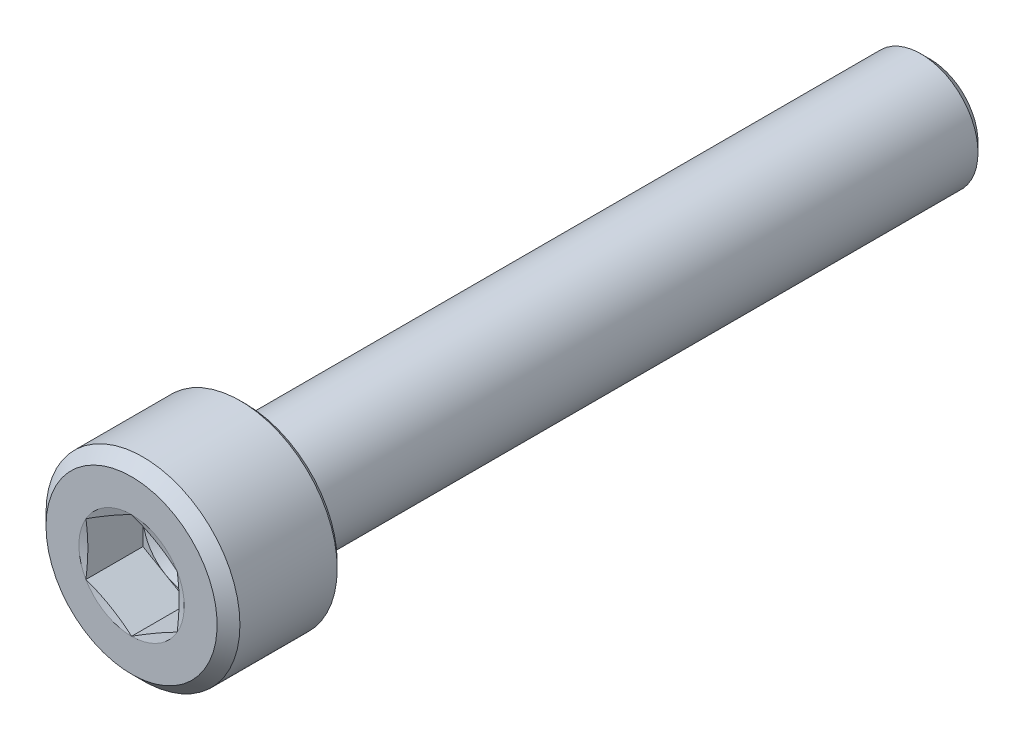
ISO-10303-21;
HEADER;
FILE_DESCRIPTION(('STEP AP214'),'2;1');
FILE_NAME('part.step','',(''),(''),'','','');
FILE_SCHEMA(('AUTOMOTIVE_DESIGN { 1 0 10303 214 1 1 1 1 }'));
ENDSEC;
DATA;
#1=APPLICATION_CONTEXT('core data for automotive mechanical design processes');
#2=APPLICATION_PROTOCOL_DEFINITION('international standard','automotive_design',2000,#1);
#3=PRODUCT_CONTEXT('',#1,'mechanical');
#4=PRODUCT('Part','Part','',(#3));
#5=PRODUCT_RELATED_PRODUCT_CATEGORY('part','',(#4));
#6=PRODUCT_DEFINITION_FORMATION('','',#4);
#7=PRODUCT_DEFINITION_CONTEXT('part definition',#1,'design');
#8=PRODUCT_DEFINITION('design','',#6,#7);
#9=PRODUCT_DEFINITION_SHAPE('','',#8);
#10=(LENGTH_UNIT() NAMED_UNIT(*) SI_UNIT(.MILLI.,.METRE.));
#11=(NAMED_UNIT(*) PLANE_ANGLE_UNIT() SI_UNIT($,.RADIAN.));
#12=(NAMED_UNIT(*) SI_UNIT($,.STERADIAN.) SOLID_ANGLE_UNIT());
#13=UNCERTAINTY_MEASURE_WITH_UNIT(LENGTH_MEASURE(1.E-05),#10,'distance_accuracy_value','');
#14=(GEOMETRIC_REPRESENTATION_CONTEXT(3) GLOBAL_UNCERTAINTY_ASSIGNED_CONTEXT((#13)) GLOBAL_UNIT_ASSIGNED_CONTEXT((#10,
#11,#12)) REPRESENTATION_CONTEXT('',''));
#15=CARTESIAN_POINT('',(0.,0.,0.));
#16=DIRECTION('',(0.,0.,1.));
#17=DIRECTION('',(1.,0.,0.));
#18=AXIS2_PLACEMENT_3D('',#15,#16,#17);
#19=CARTESIAN_POINT('',(2.,1.15470053837925,-2.5));
#20=DIRECTION('',(0.5,0.866025403784439,0.));
#21=DIRECTION('',(0.,0.,-1.));
#22=AXIS2_PLACEMENT_3D('',#19,#20,#21);
#23=PLANE('',#22);
#24=CARTESIAN_POINT('',(0.,2.3094010767585,0.));
#25=CARTESIAN_POINT('',(0.0425633823119709,2.28482382570566,-0.00658527078297476));
#26=CARTESIAN_POINT('',(0.0851609621981744,2.26022123386399,-0.0128624617924369));
#27=CARTESIAN_POINT('',(0.169590719267182,2.21146278990734,-0.0246149197548439));
#28=CARTESIAN_POINT('',(0.211421466351945,2.18730767178011,-0.0301035344043213));
#29=CARTESIAN_POINT('',(0.294534709698704,2.13933338683679,-0.040280933909989));
#30=CARTESIAN_POINT('',(0.335816093292774,2.11551457414403,-0.0449804129267517));
#31=CARTESIAN_POINT('',(0.418067328723173,2.06807245954831,-0.0535800869691));
#32=CARTESIAN_POINT('',(0.459036573992681,2.04444936338046,-0.0574872034397301));
#33=CARTESIAN_POINT('',(0.542105942407446,1.9964713268923,-0.0646202919637414));
#34=CARTESIAN_POINT('',(0.584206512798949,1.97211395870297,-0.0678248446642616));
#35=CARTESIAN_POINT('',(0.667845331882696,1.92372969130639,-0.0733062525415356));
#36=CARTESIAN_POINT('',(0.709382918692335,1.89970310083371,-0.0755958396504206));
#37=CARTESIAN_POINT('',(0.792314561065246,1.85180334473725,-0.0792518110133403));
#38=CARTESIAN_POINT('',(0.833708317497489,1.82793000580705,-0.0806226814230358));
#39=CARTESIAN_POINT('',(0.916742308626357,1.78006798987556,-0.0824510114905856));
#40=CARTESIAN_POINT('',(0.958382685265035,1.75607937336024,-0.0829035836538504));
#41=CARTESIAN_POINT('',(1.04160656499749,1.70802844834745,-0.0829039536078804));
#42=CARTESIAN_POINT('',(1.08319008000349,1.68396616048509,-0.0824519850713464));
#43=CARTESIAN_POINT('',(1.16614232267812,1.6359959725784,-0.0806244508305484));
#44=CARTESIAN_POINT('',(1.20751106141079,1.6120879122194,-0.0792536194503931));
#45=CARTESIAN_POINT('',(1.29046039872099,1.56421931101609,-0.075597576905792));
#46=CARTESIAN_POINT('',(1.33204099774182,1.54025912804585,-0.0733077208074989));
#47=CARTESIAN_POINT('',(1.4157769716645,1.49200969870299,-0.0678257908964699));
#48=CARTESIAN_POINT('',(1.45793172268238,1.46772084361545,-0.0646208369566601));
#49=CARTESIAN_POINT('',(1.54102078903926,1.4197637523774,-0.0574880406163537));
#50=CARTESIAN_POINT('',(1.58195747255381,1.39609636968376,-0.053581927053499));
#51=CARTESIAN_POINT('',(1.6641612654645,1.34858874355377,-0.0449835352058574));
#52=CARTESIAN_POINT('',(1.70542789927246,1.32474894442612,-0.0402842703166062));
#53=CARTESIAN_POINT('',(1.78853179531606,1.27675920888577,-0.0301068254493336));
#54=CARTESIAN_POINT('',(1.83036819240582,1.25261006903423,-0.0246178875385511));
#55=CARTESIAN_POINT('',(1.91481706725898,1.20386805540337,-0.0128642509205647));
#56=CARTESIAN_POINT('',(1.95742818508913,1.1792760521365,-0.00658614229819594));
#57=CARTESIAN_POINT('',(2.,1.15470053837925,0.));
#58=B_SPLINE_CURVE_WITH_KNOTS('',3,(#24,#25,#26,#27,#28,#29,#30,#31,#32,#33,#34,#35,#36,#37,#38,
#39,#40,#41,#42,#43,#44,#45,#46,#47,#48,#49,#50,#51,#52,#53,#54,#55,#56,#57),.UNSPECIFIED.,.F.,
.F.,(4,2,2,2,2,2,2,2,2,2,2,2,2,2,2,2,4),(0.,0.148766874535286,0.294606820686169,
0.438274846282944,0.580628017656161,0.726853447545081,0.87096665161791,1.01437091148585,
1.15853643630558,1.30266472322194,1.44605605797195,1.59018143609231,1.73644485761236,
1.87877967487471,2.02244082191178,2.16828655385211,2.31707290991441),.UNSPECIFIED.);
#59=CARTESIAN_POINT('',(0.,2.30940107675851,0.));
#60=VERTEX_POINT('',#59);
#61=CARTESIAN_POINT('',(2.,1.15470053837925,0.));
#62=VERTEX_POINT('',#61);
#63=EDGE_CURVE('E261',#60,#62,#58,.T.);
#64=ORIENTED_EDGE('',*,*,#63,.F.);
#65=DIRECTION('',(0.,0.,1.));
#66=VECTOR('',#65,1.);
#67=CARTESIAN_POINT('',(0.,2.30940107675851,-2.5));
#68=LINE('',#67,#66);
#69=CARTESIAN_POINT('',(0.,2.30940107675851,-2.5));
#70=VERTEX_POINT('',#69);
#71=EDGE_CURVE('E341',#70,#60,#68,.T.);
#72=ORIENTED_EDGE('',*,*,#71,.F.);
#73=DIRECTION('',(-0.866025403784439,0.5,0.));
#74=VECTOR('',#73,1.);
#75=CARTESIAN_POINT('',(2.,1.15470053837925,-2.5));
#76=LINE('',#75,#74);
#77=CARTESIAN_POINT('',(1.,1.73205080756888,-2.5));
#78=VERTEX_POINT('',#77);
#79=EDGE_CURVE('E248',#78,#70,#76,.T.);
#80=ORIENTED_EDGE('',*,*,#79,.F.);
#81=DIRECTION('',(-0.866025403784439,0.5,0.));
#82=VECTOR('',#81,1.);
#83=CARTESIAN_POINT('',(2.,1.15470053837925,-2.5));
#84=LINE('',#83,#82);
#85=CARTESIAN_POINT('',(2.,1.15470053837925,-2.5));
#86=VERTEX_POINT('',#85);
#87=EDGE_CURVE('E235',#86,#78,#84,.T.);
#88=ORIENTED_EDGE('',*,*,#87,.F.);
#89=DIRECTION('',(0.,0.,1.));
#90=VECTOR('',#89,1.);
#91=CARTESIAN_POINT('',(2.,1.15470053837925,-2.5));
#92=LINE('',#91,#90);
#93=EDGE_CURVE('E11',#86,#62,#92,.T.);
#94=ORIENTED_EDGE('',*,*,#93,.T.);
#95=EDGE_LOOP('',(#64,#72,#80,#88,#94));
#96=FACE_BOUND('',#95,.T.);
#97=ADVANCED_FACE('F17',(#96),#23,.F.);
#98=CARTESIAN_POINT('',(2.,-1.15470053837925,-2.5));
#99=DIRECTION('',(1.,0.,0.));
#100=DIRECTION('',(0.,1.,0.));
#101=AXIS2_PLACEMENT_3D('',#98,#99,#100);
#102=PLANE('',#101);
#103=CARTESIAN_POINT('',(2.,1.15470053837925,0.));
#104=CARTESIAN_POINT('',(1.9999971758146,1.10559938016855,-0.00657877825937162));
#105=CARTESIAN_POINT('',(1.99998944699676,1.05645602304888,-0.0128501009115137));
#106=CARTESIAN_POINT('',(1.99997806658765,0.959054194252896,-0.0245924298625357));
#107=CARTESIAN_POINT('',(1.99997433781248,0.910797323995098,-0.0300767483155109));
#108=CARTESIAN_POINT('',(1.99998359751542,0.81492579320712,-0.0402471560748688));
#109=CARTESIAN_POINT('',(1.9999963378607,0.767312271204178,-0.0449439165892805));
#110=CARTESIAN_POINT('',(2.00003546653749,0.672453111011467,-0.0535397458043652));
#111=CARTESIAN_POINT('',(2.00006172870545,0.625208100919636,-0.0574457313280469));
#112=CARTESIAN_POINT('',(2.00004611837403,0.529274763219141,-0.0645855968989982));
#113=CARTESIAN_POINT('',(2.00000222670508,0.480584711064261,-0.0677964274113592));
#114=CARTESIAN_POINT('',(1.99991841748751,0.383860331701837,-0.0732888727540297));
#115=CARTESIAN_POINT('',(1.99987845152948,0.335826737171599,-0.0755832901194108));
#116=CARTESIAN_POINT('',(1.99986366588704,0.239962717981797,-0.0792453120947795));
#117=CARTESIAN_POINT('',(1.9998885239626,0.192132467715618,-0.0806174586142727));
#118=CARTESIAN_POINT('',(1.99994941208485,0.0962015340396727,-0.08245246044446));
#119=CARTESIAN_POINT('',(1.99998550051117,0.0481007579972217,-0.0829104692770044));
#120=CARTESIAN_POINT('',(2.,0.,-0.0829037686547589));
#121=B_SPLINE_CURVE_WITH_KNOTS('',3,(#103,#104,#105,#106,#107,#108,#109,#110,#111,#112,#113,
#114,#115,#116,#117,#118,#119,#120),.UNSPECIFIED.,.F.,.F.,(4,2,2,2,2,2,2,2,4),(0.,
0.148620259481538,0.294318135051254,0.437846221402298,0.580058773528502,0.726438720844375,
0.870695461275644,1.01423647053232,1.15853648999317),.UNSPECIFIED.);
#122=CARTESIAN_POINT('',(2.,0.,-0.082903768654759));
#123=VERTEX_POINT('',#122);
#124=EDGE_CURVE('E443',#62,#123,#121,.T.);
#125=ORIENTED_EDGE('',*,*,#124,.F.);
#126=ORIENTED_EDGE('',*,*,#93,.F.);
#127=DIRECTION('',(0.,1.,0.));
#128=VECTOR('',#127,1.);
#129=CARTESIAN_POINT('',(2.,-1.15470053837925,-2.5));
#130=LINE('',#129,#128);
#131=CARTESIAN_POINT('',(2.,0.,-2.5));
#132=VERTEX_POINT('',#131);
#133=EDGE_CURVE('E224',#132,#86,#130,.T.);
#134=ORIENTED_EDGE('',*,*,#133,.F.);
#135=DIRECTION('',(0.,1.,0.));
#136=VECTOR('',#135,1.);
#137=CARTESIAN_POINT('',(2.,-1.15470053837925,-2.5));
#138=LINE('',#137,#136);
#139=CARTESIAN_POINT('',(2.,-1.15470053837925,-2.5));
#140=VERTEX_POINT('',#139);
#141=EDGE_CURVE('E220',#140,#132,#138,.T.);
#142=ORIENTED_EDGE('',*,*,#141,.F.);
#143=DIRECTION('',(0.,0.,1.));
#144=VECTOR('',#143,1.);
#145=CARTESIAN_POINT('',(2.,-1.15470053837925,-2.5));
#146=LINE('',#145,#144);
#147=CARTESIAN_POINT('',(2.,-1.15470053837925,0.));
#148=VERTEX_POINT('',#147);
#149=EDGE_CURVE('E31',#140,#148,#146,.T.);
#150=ORIENTED_EDGE('',*,*,#149,.T.);
#151=CARTESIAN_POINT('',(2.,0.,-0.0829037686547589));
#152=CARTESIAN_POINT('',(1.99998555981411,-0.0480626337482096,-0.0829104454697722));
#153=CARTESIAN_POINT('',(1.99995090495526,-0.0961252790550645,-0.0824527966371758));
#154=CARTESIAN_POINT('',(1.99989390848693,-0.191988216165346,-0.0806195306727037));
#155=CARTESIAN_POINT('',(1.9998715050684,-0.23978859752026,-0.0792486003594746));
#156=CARTESIAN_POINT('',(1.99989058893969,-0.335600482143639,-0.0755899847635507));
#157=CARTESIAN_POINT('',(1.99993240569122,-0.383611805647936,-0.0732976169410381));
#158=CARTESIAN_POINT('',(2.00001693407639,-0.480298664501986,-0.0678104164072034));
#159=CARTESIAN_POINT('',(2.00005964977091,-0.528973461379009,-0.0646026718115913));
#160=CARTESIAN_POINT('',(2.00007157520278,-0.624916052866736,-0.0574667105464565));
#161=CARTESIAN_POINT('',(2.00004278566152,-0.67218552115141,-0.0535608791712345));
#162=CARTESIAN_POINT('',(2.00000007634783,-0.767094417138231,-0.0449640408208166));
#163=CARTESIAN_POINT('',(1.99998629681263,-0.814733214974058,-0.040266094585913));
#164=CARTESIAN_POINT('',(1.99997547969609,-0.910656840517129,-0.0300922148547882));
#165=CARTESIAN_POINT('',(1.99997869881092,-0.958940526378031,-0.0246055771048901));
#166=CARTESIAN_POINT('',(1.99998947348254,-1.05639814339213,-0.0128574794542081));
#167=CARTESIAN_POINT('',(1.99999711487367,-1.10557046827418,-0.00658266592061943));
#168=CARTESIAN_POINT('',(2.,-1.15470053837925,0.));
#169=B_SPLINE_CURVE_WITH_KNOTS('',3,(#151,#152,#153,#154,#155,#156,#157,#158,#159,#160,#161,
#162,#163,#164,#165,#166,#167,#168),.UNSPECIFIED.,.F.,.F.,(4,2,2,2,2,2,2,2,4),(0.,
0.144185638963415,0.287636981833131,0.431826719642445,0.578160405495087,0.720446033944631,
0.864049915829581,1.00982849989602,1.15853627726478),.UNSPECIFIED.);
#170=EDGE_CURVE('E469',#123,#148,#169,.T.);
#171=ORIENTED_EDGE('',*,*,#170,.F.);
#172=EDGE_LOOP('',(#125,#126,#134,#142,#150,#171));
#173=FACE_BOUND('',#172,.T.);
#174=ADVANCED_FACE('F222',(#173),#102,.F.);
#175=CARTESIAN_POINT('',(0.,-2.3094010767585,-2.5));
#176=DIRECTION('',(0.5,-0.866025403784439,0.));
#177=DIRECTION('',(0.,0.,-1.));
#178=AXIS2_PLACEMENT_3D('',#175,#176,#177);
#179=PLANE('',#178);
#180=CARTESIAN_POINT('',(2.,-1.15470053837925,0.));
#181=CARTESIAN_POINT('',(1.95743378507766,-1.17927288320565,-0.0065852707828837));
#182=CARTESIAN_POINT('',(1.91482852560134,-1.20386217360572,-0.0128624617922492));
#183=CARTESIAN_POINT('',(1.83038759595222,-1.2526012660842,-0.0246149197545318));
#184=CARTESIAN_POINT('',(1.78855327648046,-1.27675019665525,-0.030103534403975));
#185=CARTESIAN_POINT('',(1.7054497053178,-1.32474123431294,-0.0402809339096389));
#186=CARTESIAN_POINT('',(1.66418131664067,-1.34858255486255,-0.0449804129264252));
#187=CARTESIAN_POINT('',(1.58196962247549,-1.39609315694039,-0.0535800869689056));
#188=CARTESIAN_POINT('',(1.5410267984427,-1.4197620160339,-0.0574872034396377));
#189=CARTESIAN_POINT('',(1.45794191581271,-1.46771318111302,-0.0646202919637392));
#190=CARTESIAN_POINT('',(1.41579753099615,-1.49199466049072,-0.0678248446642694));
#191=CARTESIAN_POINT('',(1.33207611674604,-1.54023586886093,-0.0733062525415533));
#192=CARTESIAN_POINT('',(1.29049968562577,-1.56419517901357,-0.075595839650431));
#193=CARTESIAN_POINT('',(1.20755145882476,-1.61206621003797,-0.079251811013348));
#194=CARTESIAN_POINT('',(1.16617966262179,-1.63597758520144,-0.0806226814230399));
#195=CARTESIAN_POINT('',(1.08321294538366,-1.68395612293148,-0.0824510114905914));
#196=CARTESIAN_POINT('',(1.04161800575987,-1.70802343866645,-0.0829035836538532));
#197=CARTESIAN_POINT('',(0.958392744156322,-1.7560719702104,-0.0829039536078792));
#198=CARTESIAN_POINT('',(0.916762434090979,-1.78005320665323,-0.0824519850713494));
#199=CARTESIAN_POINT('',(0.833742911401647,-1.82790686215718,-0.080624450830552));
#200=CARTESIAN_POINT('',(0.792353554409066,-1.85177921064272,-0.0792536194503983));
#201=CARTESIAN_POINT('',(0.709423461068239,-1.89968114337871,-0.0755975769057984));
#202=CARTESIAN_POINT('',(0.667883034426375,-1.92371090695011,-0.0733077208075098));
#203=CARTESIAN_POINT('',(0.584229815936511,-1.97210367290616,-0.067825790896475));
#204=CARTESIAN_POINT('',(0.542117674893325,-1.99646633063398,-0.0646208369566592));
#205=CARTESIAN_POINT('',(0.459041082411246,-2.04444502725692,-0.0574880406162984));
#206=CARTESIAN_POINT('',(0.418076185999905,-2.06806354378067,-0.0535819270533825));
#207=CARTESIAN_POINT('',(0.335831478442079,-2.1155003036641,-0.0449835352056614));
#208=CARTESIAN_POINT('',(0.294552289872298,-2.13931835730668,-0.0402842703163962));
#209=CARTESIAN_POINT('',(0.211440011751603,-2.18729357466367,-0.0301068254491258));
#210=CARTESIAN_POINT('',(0.169608044615814,-2.21145038742034,-0.0246178875383639));
#211=CARTESIAN_POINT('',(0.0851717851537173,-2.26021425154841,-0.012864250920452));
#212=CARTESIAN_POINT('',(0.0425689266799132,-2.2848205604393,-0.00658614229814123));
#213=CARTESIAN_POINT('',(0.,-2.3094010767585,0.));
#214=B_SPLINE_CURVE_WITH_KNOTS('',3,(#180,#181,#182,#183,#184,#185,#186,#187,#188,#189,#190,
#191,#192,#193,#194,#195,#196,#197,#198,#199,#200,#201,#202,#203,#204,#205,#206,#207,#208,#209,
#210,#211,#212,#213),.UNSPECIFIED.,.F.,.F.,(4,2,2,2,2,2,2,2,2,2,2,2,2,2,2,2,4),(0.,
0.148766874533244,0.294606820683524,0.438274846281021,0.58062801765617,0.726853447543114,
0.870966651615286,1.01437091148389,1.15853643630559,1.30266472322314,1.44605605797354,
1.5901814360935,1.73644485761236,1.87877967487588,2.02244082191339,2.16828655385335,
2.31707290991442),.UNSPECIFIED.);
#215=CARTESIAN_POINT('',(0.,-2.30940107675851,0.));
#216=VERTEX_POINT('',#215);
#217=EDGE_CURVE('E213',#148,#216,#214,.T.);
#218=ORIENTED_EDGE('',*,*,#217,.F.);
#219=ORIENTED_EDGE('',*,*,#149,.F.);
#220=DIRECTION('',(0.866025403784439,0.5,0.));
#221=VECTOR('',#220,1.);
#222=CARTESIAN_POINT('',(0.,-2.3094010767585,-2.5));
#223=LINE('',#222,#221);
#224=CARTESIAN_POINT('',(1.,-1.73205080756887,-2.5));
#225=VERTEX_POINT('',#224);
#226=EDGE_CURVE('E210',#225,#140,#223,.T.);
#227=ORIENTED_EDGE('',*,*,#226,.F.);
#228=DIRECTION('',(0.866025403784439,0.5,0.));
#229=VECTOR('',#228,1.);
#230=CARTESIAN_POINT('',(0.,-2.3094010767585,-2.5));
#231=LINE('',#230,#229);
#232=CARTESIAN_POINT('',(0.,-2.3094010767585,-2.5));
#233=VERTEX_POINT('',#232);
#234=EDGE_CURVE('E255',#233,#225,#231,.T.);
#235=ORIENTED_EDGE('',*,*,#234,.F.);
#236=DIRECTION('',(0.,0.,1.));
#237=VECTOR('',#236,1.);
#238=CARTESIAN_POINT('',(0.,-2.3094010767585,-2.5));
#239=LINE('',#238,#237);
#240=EDGE_CURVE('E199',#233,#216,#239,.T.);
#241=ORIENTED_EDGE('',*,*,#240,.T.);
#242=EDGE_LOOP('',(#218,#219,#227,#235,#241));
#243=FACE_BOUND('',#242,.T.);
#244=ADVANCED_FACE('F208',(#243),#179,.F.);
#245=CARTESIAN_POINT('',(-2.,-1.15470053837925,-2.5));
#246=DIRECTION('',(-0.5,-0.866025403784439,0.));
#247=DIRECTION('',(-0.866025403784439,0.5,0.));
#248=AXIS2_PLACEMENT_3D('',#245,#246,#247);
#249=PLANE('',#248);
#250=CARTESIAN_POINT('',(0.,-2.3094010767585,0.));
#251=CARTESIAN_POINT('',(-0.0425633823124517,-2.28482382570538,-0.00658527078305046));
#252=CARTESIAN_POINT('',(-0.0851609621991149,-2.26022123386338,-0.0128624617925928));
#253=CARTESIAN_POINT('',(-0.169590719268688,-2.21146278990626,-0.024614919755103));
#254=CARTESIAN_POINT('',(-0.211421466353557,-2.18730767177888,-0.0301035344046088));
#255=CARTESIAN_POINT('',(-0.294534709700233,-2.13933338683548,-0.04028093391028));
#256=CARTESIAN_POINT('',(-0.335816093294115,-2.11551457414279,-0.0449804129270233));
#257=CARTESIAN_POINT('',(-0.418067328723942,-2.06807245954753,-0.0535800869692619));
#258=CARTESIAN_POINT('',(-0.459036573993066,-2.04444936338007,-0.0574872034398075));
#259=CARTESIAN_POINT('',(-0.542105942407995,-1.99647132689215,-0.0646202919637441));
#260=CARTESIAN_POINT('',(-0.584206512800049,-1.97211395870268,-0.0678248446642561));
#261=CARTESIAN_POINT('',(-0.667845331884484,-1.92372969130583,-0.0733062525415221));
#262=CARTESIAN_POINT('',(-0.709382918694263,-1.89970310083303,-0.0755958396504133));
#263=CARTESIAN_POINT('',(-0.792314561067119,-1.85180334473646,-0.0792518110133352));
#264=CARTESIAN_POINT('',(-0.833708317499165,-1.82793000580629,-0.0806226814230336));
#265=CARTESIAN_POINT('',(-0.916742308627337,-1.78006798987506,-0.0824510114905825));
#266=CARTESIAN_POINT('',(-0.958382685265516,-1.75607937335996,-0.0829035836538506));
#267=CARTESIAN_POINT('',(-1.04160656499709,-1.70802844834768,-0.0829039536078818));
#268=CARTESIAN_POINT('',(-1.08319008000271,-1.68396616048559,-0.0824519850713441));
#269=CARTESIAN_POINT('',(-1.16614232267685,-1.6359959725793,-0.0806244508305463));
#270=CARTESIAN_POINT('',(-1.20751106140942,-1.61208791222044,-0.0792536194503888));
#271=CARTESIAN_POINT('',(-1.29046039871966,-1.56421931101721,-0.0755975769057861));
#272=CARTESIAN_POINT('',(-1.33204099774065,-1.54025912804693,-0.0733077208074876));
#273=CARTESIAN_POINT('',(-1.41577697166382,-1.49200969870367,-0.0678257908964654));
#274=CARTESIAN_POINT('',(-1.45793172268204,-1.4677208436158,-0.0646208369566626));
#275=CARTESIAN_POINT('',(-1.5410207890388,-1.41976375237752,-0.0574880406164197));
#276=CARTESIAN_POINT('',(-1.58195747255291,-1.39609636968399,-0.0535819270536368));
#277=CARTESIAN_POINT('',(-1.66416126546302,-1.34858874355423,-0.0449835352060884));
#278=CARTESIAN_POINT('',(-1.70542789927084,-1.32474894442669,-0.0402842703168537));
#279=CARTESIAN_POINT('',(-1.78853179531446,-1.27675920888644,-0.0301068254495781));
#280=CARTESIAN_POINT('',(-1.83036819240438,-1.25261006903488,-0.0246178875387715));
#281=CARTESIAN_POINT('',(-1.91481706725812,-1.20386805540381,-0.0128642509206973));
#282=CARTESIAN_POINT('',(-1.95742818508871,-1.17927605213674,-0.00658614229826027));
#283=CARTESIAN_POINT('',(-2.,-1.15470053837926,0.));
#284=B_SPLINE_CURVE_WITH_KNOTS('',3,(#250,#251,#252,#253,#254,#255,#256,#257,#258,#259,#260,
#261,#262,#263,#264,#265,#266,#267,#268,#269,#270,#271,#272,#273,#274,#275,#276,#277,#278,#279,
#280,#281,#282,#283),.UNSPECIFIED.,.F.,.F.,(4,2,2,2,2,2,2,2,2,2,2,2,2,2,2,2,4),(0.,
0.148766874536984,0.294606820688371,0.438274846284549,0.580628017656168,0.726853447546727,
0.870966651620108,1.01437091148751,1.15853643630558,1.30266472322055,1.44605605797009,
1.59018143609091,1.73644485761235,1.87877967487335,2.02244082190991,2.16828655385066,
2.3170729099144),.UNSPECIFIED.);
#285=CARTESIAN_POINT('',(-2.,-1.15470053837925,0.));
#286=VERTEX_POINT('',#285);
#287=EDGE_CURVE('E407',#216,#286,#284,.T.);
#288=ORIENTED_EDGE('',*,*,#287,.F.);
#289=ORIENTED_EDGE('',*,*,#240,.F.);
#290=DIRECTION('',(0.866025403784439,-0.5,0.));
#291=VECTOR('',#290,1.);
#292=CARTESIAN_POINT('',(-2.,-1.15470053837925,-2.5));
#293=LINE('',#292,#291);
#294=CARTESIAN_POINT('',(-1.,-1.73205080756887,-2.5));
#295=VERTEX_POINT('',#294);
#296=EDGE_CURVE('E228',#295,#233,#293,.T.);
#297=ORIENTED_EDGE('',*,*,#296,.F.);
#298=DIRECTION('',(0.866025403784439,-0.5,0.));
#299=VECTOR('',#298,1.);
#300=CARTESIAN_POINT('',(-2.,-1.15470053837925,-2.5));
#301=LINE('',#300,#299);
#302=CARTESIAN_POINT('',(-2.,-1.15470053837925,-2.5));
#303=VERTEX_POINT('',#302);
#304=EDGE_CURVE('E98',#303,#295,#301,.T.);
#305=ORIENTED_EDGE('',*,*,#304,.F.);
#306=DIRECTION('',(0.,0.,1.));
#307=VECTOR('',#306,1.);
#308=CARTESIAN_POINT('',(-2.,-1.15470053837925,-2.5));
#309=LINE('',#308,#307);
#310=EDGE_CURVE('E193',#303,#286,#309,.T.);
#311=ORIENTED_EDGE('',*,*,#310,.T.);
#312=EDGE_LOOP('',(#288,#289,#297,#305,#311));
#313=FACE_BOUND('',#312,.T.);
#314=ADVANCED_FACE('F414',(#313),#249,.F.);
#315=CARTESIAN_POINT('',(-2.,1.15470053837925,-2.5));
#316=DIRECTION('',(-1.,0.,0.));
#317=DIRECTION('',(0.,0.,1.));
#318=AXIS2_PLACEMENT_3D('',#315,#316,#317);
#319=PLANE('',#318);
#320=CARTESIAN_POINT('',(-2.,-1.15470053837926,0.));
#321=CARTESIAN_POINT('',(-1.99999713341261,-1.10548960119524,-0.00659349994683994));
#322=CARTESIAN_POINT('',(-1.99999001439798,-1.05623625144953,-0.0128780060927307));
#323=CARTESIAN_POINT('',(-1.99998060910477,-0.958615251215465,-0.0246431934130829));
#324=CARTESIAN_POINT('',(-1.99997823064012,-0.910249208018163,-0.0301372396865746));
#325=CARTESIAN_POINT('',(-1.99999041666403,-0.814158446504453,-0.0403236142290196));
#326=CARTESIAN_POINT('',(-2.00000473011996,-0.76643486816009,-0.0450266347192323));
#327=CARTESIAN_POINT('',(-2.00004652000518,-0.671352739896966,-0.0536314900251229));
#328=CARTESIAN_POINT('',(-2.00007387560003,-0.623994815190128,-0.0575402190336094));
#329=CARTESIAN_POINT('',(-2.00005845896974,-0.527888120565473,-0.0646777765433628));
#330=CARTESIAN_POINT('',(-2.00001369287065,-0.479137692036126,-0.0678843923543035));
#331=CARTESIAN_POINT('',(-1.99992846343813,-0.38229572529829,-0.0733654519077141));
#332=CARTESIAN_POINT('',(-1.99988794697284,-0.334204921765323,-0.0756527809453042));
#333=CARTESIAN_POINT('',(-1.99986859003052,-0.238227588755144,-0.0792997958800163));
#334=CARTESIAN_POINT('',(-1.99988944362067,-0.190341233728829,-0.0806640416301184));
#335=CARTESIAN_POINT('',(-1.99995548502895,-0.0942971448419419,-0.0824747486435702));
#336=CARTESIAN_POINT('',(-2.00000080135689,-0.0461393190190874,-0.0829163025262149));
#337=CARTESIAN_POINT('',(-1.99999920117611,0.0500238603427236,-0.0828907294700894));
#338=CARTESIAN_POINT('',(-1.9999525757529,0.0980292146733851,-0.0824264703640131));
#339=CARTESIAN_POINT('',(-1.99988530566595,0.193778523562446,-0.0805761348477542));
#340=CARTESIAN_POINT('',(-1.99986453033935,0.241522568216185,-0.079194749030331));
#341=CARTESIAN_POINT('',(-1.99988319873575,0.337220665629865,-0.0755193070115986));
#342=CARTESIAN_POINT('',(-1.99992295205882,0.385174538655754,-0.073220603238064));
#343=CARTESIAN_POINT('',(-2.00000494629768,0.481743325463302,-0.0677226422132793));
#344=CARTESIAN_POINT('',(-2.00004721534993,0.530357502799515,-0.0645105427039974));
#345=CARTESIAN_POINT('',(-2.00005964394824,0.62612676012278,-0.0573722164336154));
#346=CARTESIAN_POINT('',(-2.00003184313588,0.673283579034134,-0.0534691942966007));
#347=CARTESIAN_POINT('',(-1.99999170713457,0.767970011400858,-0.0448814384269832));
#348=CARTESIAN_POINT('',(-1.99997951884658,0.815498992151107,-0.0401897428011197));
#349=CARTESIAN_POINT('',(-1.99997163040192,0.911203850654714,-0.030031812894688));
#350=CARTESIAN_POINT('',(-1.9999761835141,0.959378588033395,-0.0245548958453313));
#351=CARTESIAN_POINT('',(-1.99998890540873,1.0566174773319,-0.0128296293417804));
#352=CARTESIAN_POINT('',(-1.99999714507433,1.10568002885256,-0.00656797916916223));
#353=CARTESIAN_POINT('',(-2.,1.15470053837925,0.));
#354=B_SPLINE_CURVE_WITH_KNOTS('',3,(#320,#321,#322,#323,#324,#325,#326,#327,#328,#329,#330,
#331,#332,#333,#334,#335,#336,#337,#338,#339,#340,#341,#342,#343,#344,#345,#346,#347,#348,#349,
#350,#351,#352,#353),.UNSPECIFIED.,.F.,.F.,(4,2,2,2,2,2,2,2,2,2,2,2,2,2,2,2,4),(0.,
0.148952547682911,0.294979106594678,0.438837566790982,0.581388350232403,0.72794815627218,
0.872375335412716,1.01608375931162,1.16055457798047,1.30456873960764,1.44785196522356,
1.59187054107806,1.73802363231839,1.87997181997091,2.02324604190021,2.16869661516907,
2.3170727653732),.UNSPECIFIED.);
#355=CARTESIAN_POINT('',(-2.,1.15470053837925,0.));
#356=VERTEX_POINT('',#355);
#357=EDGE_CURVE('E329',#286,#356,#354,.T.);
#358=ORIENTED_EDGE('',*,*,#357,.F.);
#359=ORIENTED_EDGE('',*,*,#310,.F.);
#360=DIRECTION('',(0.,-1.,0.));
#361=VECTOR('',#360,1.);
#362=CARTESIAN_POINT('',(-2.,1.15470053837925,-2.5));
#363=LINE('',#362,#361);
#364=CARTESIAN_POINT('',(-2.,0.,-2.5));
#365=VERTEX_POINT('',#364);
#366=EDGE_CURVE('E262',#365,#303,#363,.T.);
#367=ORIENTED_EDGE('',*,*,#366,.F.);
#368=DIRECTION('',(0.,-1.,0.));
#369=VECTOR('',#368,1.);
#370=CARTESIAN_POINT('',(-2.,1.15470053837925,-2.5));
#371=LINE('',#370,#369);
#372=CARTESIAN_POINT('',(-2.,1.15470053837925,-2.5));
#373=VERTEX_POINT('',#372);
#374=EDGE_CURVE('E113',#373,#365,#371,.T.);
#375=ORIENTED_EDGE('',*,*,#374,.F.);
#376=DIRECTION('',(0.,0.,1.));
#377=VECTOR('',#376,1.);
#378=CARTESIAN_POINT('',(-2.,1.15470053837925,-2.5));
#379=LINE('',#378,#377);
#380=EDGE_CURVE('E46',#373,#356,#379,.T.);
#381=ORIENTED_EDGE('',*,*,#380,.T.);
#382=EDGE_LOOP('',(#358,#359,#367,#375,#381));
#383=FACE_BOUND('',#382,.T.);
#384=ADVANCED_FACE('F19',(#383),#319,.F.);
#385=CARTESIAN_POINT('',(0.,2.30940107675851,-2.5));
#386=DIRECTION('',(-0.5,0.866025403784439,0.));
#387=DIRECTION('',(0.,0.,1.));
#388=AXIS2_PLACEMENT_3D('',#385,#386,#387);
#389=PLANE('',#388);
#390=CARTESIAN_POINT('',(-2.,1.15470053837925,0.));
#391=CARTESIAN_POINT('',(-1.95743378507658,1.17927288320626,-0.00658527078305043));
#392=CARTESIAN_POINT('',(-1.91482852559914,1.20386217360685,-0.0128624617925928));
#393=CARTESIAN_POINT('',(-1.83038759594849,1.25260126608589,-0.0246149197551029));
#394=CARTESIAN_POINT('',(-1.78855327647633,1.27675019665698,-0.0301035344046087));
#395=CARTESIAN_POINT('',(-1.70544970531361,1.32474123431442,-0.0402809339102798));
#396=CARTESIAN_POINT('',(-1.66418131663682,1.34858255486375,-0.0449804129270231));
#397=CARTESIAN_POINT('',(-1.58196962247316,1.396093156941,-0.0535800869692616));
#398=CARTESIAN_POINT('',(-1.54102679844153,1.4197620160342,-0.0574872034398072));
#399=CARTESIAN_POINT('',(-1.45794191581183,1.4677131811139,-0.0646202919637438));
#400=CARTESIAN_POINT('',(-1.41579753099439,1.4919946604925,-0.0678248446642558));
#401=CARTESIAN_POINT('',(-1.332076116743,1.54023586886373,-0.0733062525415215));
#402=CARTESIAN_POINT('',(-1.29049968562234,1.5641951790165,-0.0755958396504125));
#403=CARTESIAN_POINT('',(-1.20755145882121,1.61206621004067,-0.0792518110133349));
#404=CARTESIAN_POINT('',(-1.1661796626185,1.6359775852038,-0.0806226814230341));
#405=CARTESIAN_POINT('',(-1.08321294538163,1.6839561229328,-0.0824510114905808));
#406=CARTESIAN_POINT('',(-1.04161800575884,1.70802343866708,-0.082903583653846));
#407=CARTESIAN_POINT('',(-0.958392744156581,1.75607197021023,-0.0829039536078852));
#408=CARTESIAN_POINT('',(-0.916762434091534,1.78005320665294,-0.0824519850713484));
#409=CARTESIAN_POINT('',(-0.833742911402609,1.82790686215676,-0.0806244508305478));
#410=CARTESIAN_POINT('',(-0.792353554410137,1.85177921064227,-0.0792536194503939));
#411=CARTESIAN_POINT('',(-0.709423461069339,1.89968114337832,-0.0755975769057937));
#412=CARTESIAN_POINT('',(-0.667883034427395,1.9237109069498,-0.0733077208075013));
#413=CARTESIAN_POINT('',(-0.584229815937133,1.972103672906,-0.0678257908964709));
#414=CARTESIAN_POINT('',(-0.54211767489363,1.9964663306339,-0.06462083695666));
#415=CARTESIAN_POINT('',(-0.459041082411455,2.0444450272567,-0.0574880406163423));
#416=CARTESIAN_POINT('',(-0.418076186000337,2.06806354378022,-0.0535819270534749));
#417=CARTESIAN_POINT('',(-0.335831478442842,2.11550030366339,-0.0449835352058167));
#418=CARTESIAN_POINT('',(-0.294552289873171,2.13931835730593,-0.0402842703165626));
#419=CARTESIAN_POINT('',(-0.211440011752526,2.18729357466297,-0.0301068254492905));
#420=CARTESIAN_POINT('',(-0.169608044616676,2.21145038741972,-0.0246178875385123));
#421=CARTESIAN_POINT('',(-0.0851717851542553,2.26021425154807,-0.0128642509205413));
#422=CARTESIAN_POINT('',(-0.0425689266801875,2.28482056043914,-0.00658614229818459));
#423=CARTESIAN_POINT('',(0.,2.3094010767585,0.));
#424=B_SPLINE_CURVE_WITH_KNOTS('',3,(#390,#391,#392,#393,#394,#395,#396,#397,#398,#399,#400,
#401,#402,#403,#404,#405,#406,#407,#408,#409,#410,#411,#412,#413,#414,#415,#416,#417,#418,#419,
#420,#421,#422,#423),.UNSPECIFIED.,.F.,.F.,(4,2,2,2,2,2,2,2,2,2,2,2,2,2,2,2,4),(0.,
0.148766874536988,0.294606820688377,0.438274846284552,0.580628017656167,0.726853447546728,
0.870966651620106,1.01437091148751,1.15853643630558,1.30266472322219,1.44605605797229,
1.59018143609256,1.73644485761237,1.87877967487496,2.02244082191212,2.16828655385237,
2.31707290991441),.UNSPECIFIED.);
#425=EDGE_CURVE('E348',#356,#60,#424,.T.);
#426=ORIENTED_EDGE('',*,*,#425,.F.);
#427=ORIENTED_EDGE('',*,*,#380,.F.);
#428=DIRECTION('',(-0.866025403784439,-0.5,0.));
#429=VECTOR('',#428,1.);
#430=CARTESIAN_POINT('',(0.,2.30940107675851,-2.5));
#431=LINE('',#430,#429);
#432=CARTESIAN_POINT('',(-1.,1.73205080756888,-2.5));
#433=VERTEX_POINT('',#432);
#434=EDGE_CURVE('E276',#433,#373,#431,.T.);
#435=ORIENTED_EDGE('',*,*,#434,.F.);
#436=DIRECTION('',(-0.866025403784439,-0.5,0.));
#437=VECTOR('',#436,1.);
#438=CARTESIAN_POINT('',(0.,2.30940107675851,-2.5));
#439=LINE('',#438,#437);
#440=EDGE_CURVE('E251',#70,#433,#439,.T.);
#441=ORIENTED_EDGE('',*,*,#440,.F.);
#442=ORIENTED_EDGE('',*,*,#71,.T.);
#443=EDGE_LOOP('',(#426,#427,#435,#441,#442));
#444=FACE_BOUND('',#443,.T.);
#445=ADVANCED_FACE('F458',(#444),#389,.F.);
#446=CARTESIAN_POINT('',(0.,0.,-2.5));
#447=DIRECTION('',(0.,0.,1.));
#448=DIRECTION('',(1.,0.,0.));
#449=AXIS2_PLACEMENT_3D('',#446,#447,#448);
#450=PLANE('',#449);
#451=CARTESIAN_POINT('',(0.,0.,-2.5));
#452=DIRECTION('',(0.,0.,1.));
#453=DIRECTION('',(1.,0.,0.));
#454=AXIS2_PLACEMENT_3D('',#451,#452,#453);
#455=CIRCLE('',#454,2.);
#456=EDGE_CURVE('E534',#433,#365,#455,.T.);
#457=ORIENTED_EDGE('',*,*,#456,.F.);
#458=ORIENTED_EDGE('',*,*,#434,.T.);
#459=ORIENTED_EDGE('',*,*,#374,.T.);
#460=EDGE_LOOP('',(#457,#458,#459));
#461=FACE_BOUND('',#460,.T.);
#462=ADVANCED_FACE('F735',(#461),#450,.T.);
#463=CARTESIAN_POINT('',(0.,0.,-2.5));
#464=DIRECTION('',(0.,0.,1.));
#465=DIRECTION('',(1.,0.,0.));
#466=AXIS2_PLACEMENT_3D('',#463,#464,#465);
#467=PLANE('',#466);
#468=CARTESIAN_POINT('',(0.,0.,-2.5));
#469=DIRECTION('',(0.,0.,1.));
#470=DIRECTION('',(1.,0.,0.));
#471=AXIS2_PLACEMENT_3D('',#468,#469,#470);
#472=CIRCLE('',#471,2.);
#473=EDGE_CURVE('E486',#78,#433,#472,.T.);
#474=ORIENTED_EDGE('',*,*,#473,.F.);
#475=ORIENTED_EDGE('',*,*,#79,.T.);
#476=ORIENTED_EDGE('',*,*,#440,.T.);
#477=EDGE_LOOP('',(#474,#475,#476));
#478=FACE_BOUND('',#477,.T.);
#479=ADVANCED_FACE('F739',(#478),#467,.T.);
#480=CARTESIAN_POINT('',(0.,0.,-2.5));
#481=DIRECTION('',(0.,0.,1.));
#482=DIRECTION('',(1.,0.,0.));
#483=AXIS2_PLACEMENT_3D('',#480,#481,#482);
#484=PLANE('',#483);
#485=CARTESIAN_POINT('',(0.,0.,-2.5));
#486=DIRECTION('',(0.,0.,1.));
#487=DIRECTION('',(1.,0.,0.));
#488=AXIS2_PLACEMENT_3D('',#485,#486,#487);
#489=CIRCLE('',#488,2.);
#490=EDGE_CURVE('E270',#365,#295,#489,.T.);
#491=ORIENTED_EDGE('',*,*,#490,.F.);
#492=ORIENTED_EDGE('',*,*,#366,.T.);
#493=ORIENTED_EDGE('',*,*,#304,.T.);
#494=EDGE_LOOP('',(#491,#492,#493));
#495=FACE_BOUND('',#494,.T.);
#496=ADVANCED_FACE('F314',(#495),#484,.T.);
#497=CARTESIAN_POINT('',(0.,0.,-2.5));
#498=DIRECTION('',(0.,0.,1.));
#499=DIRECTION('',(1.,0.,0.));
#500=AXIS2_PLACEMENT_3D('',#497,#498,#499);
#501=PLANE('',#500);
#502=CARTESIAN_POINT('',(0.,0.,-2.5));
#503=DIRECTION('',(0.,0.,1.));
#504=DIRECTION('',(1.,0.,0.));
#505=AXIS2_PLACEMENT_3D('',#502,#503,#504);
#506=CIRCLE('',#505,2.);
#507=EDGE_CURVE('E268',#295,#225,#506,.T.);
#508=ORIENTED_EDGE('',*,*,#507,.F.);
#509=ORIENTED_EDGE('',*,*,#296,.T.);
#510=ORIENTED_EDGE('',*,*,#234,.T.);
#511=EDGE_LOOP('',(#508,#509,#510));
#512=FACE_BOUND('',#511,.T.);
#513=ADVANCED_FACE('F542',(#512),#501,.T.);
#514=CARTESIAN_POINT('',(0.,0.,-2.5));
#515=DIRECTION('',(0.,0.,1.));
#516=DIRECTION('',(1.,0.,0.));
#517=AXIS2_PLACEMENT_3D('',#514,#515,#516);
#518=PLANE('',#517);
#519=CARTESIAN_POINT('',(0.,0.,-2.5));
#520=DIRECTION('',(0.,0.,1.));
#521=DIRECTION('',(1.,0.,0.));
#522=AXIS2_PLACEMENT_3D('',#519,#520,#521);
#523=CIRCLE('',#522,2.);
#524=EDGE_CURVE('E232',#225,#132,#523,.T.);
#525=ORIENTED_EDGE('',*,*,#524,.F.);
#526=ORIENTED_EDGE('',*,*,#226,.T.);
#527=ORIENTED_EDGE('',*,*,#141,.T.);
#528=EDGE_LOOP('',(#525,#526,#527));
#529=FACE_BOUND('',#528,.T.);
#530=ADVANCED_FACE('F230',(#529),#518,.T.);
#531=CARTESIAN_POINT('',(0.,0.,-2.5));
#532=DIRECTION('',(0.,0.,1.));
#533=DIRECTION('',(1.,0.,0.));
#534=AXIS2_PLACEMENT_3D('',#531,#532,#533);
#535=PLANE('',#534);
#536=CARTESIAN_POINT('',(0.,0.,-2.5));
#537=DIRECTION('',(0.,0.,1.));
#538=DIRECTION('',(1.,0.,0.));
#539=AXIS2_PLACEMENT_3D('',#536,#537,#538);
#540=CIRCLE('',#539,2.);
#541=EDGE_CURVE('E491',#132,#78,#540,.T.);
#542=ORIENTED_EDGE('',*,*,#541,.F.);
#543=ORIENTED_EDGE('',*,*,#133,.T.);
#544=ORIENTED_EDGE('',*,*,#87,.T.);
#545=EDGE_LOOP('',(#542,#543,#544));
#546=FACE_BOUND('',#545,.T.);
#547=ADVANCED_FACE('F304',(#546),#535,.T.);
#548=CARTESIAN_POINT('',(0.,0.,-0.0829037686547588));
#549=DIRECTION('',(0.,0.,1.));
#550=DIRECTION('',(1.,0.,0.));
#551=AXIS2_PLACEMENT_3D('',#548,#549,#550);
#552=CONICAL_SURFACE('',#551,2.,1.30899693899575);
#553=ORIENTED_EDGE('',*,*,#63,.T.);
#554=CARTESIAN_POINT('',(0.,0.,0.));
#555=DIRECTION('',(0.,0.,1.));
#556=DIRECTION('',(1.,0.,0.));
#557=AXIS2_PLACEMENT_3D('',#554,#555,#556);
#558=CIRCLE('',#557,2.30940107675851);
#559=EDGE_CURVE('E570',#62,#60,#558,.T.);
#560=ORIENTED_EDGE('',*,*,#559,.T.);
#561=EDGE_LOOP('',(#553,#560));
#562=FACE_BOUND('',#561,.T.);
#563=ADVANCED_FACE('F293',(#562),#552,.F.);
#564=CARTESIAN_POINT('',(0.,0.,-0.0829037686547588));
#565=DIRECTION('',(0.,0.,1.));
#566=DIRECTION('',(1.,0.,0.));
#567=AXIS2_PLACEMENT_3D('',#564,#565,#566);
#568=CONICAL_SURFACE('',#567,2.,1.30899693899575);
#569=ORIENTED_EDGE('',*,*,#217,.T.);
#570=CARTESIAN_POINT('',(0.,0.,0.));
#571=DIRECTION('',(0.,0.,1.));
#572=DIRECTION('',(1.,0.,0.));
#573=AXIS2_PLACEMENT_3D('',#570,#571,#572);
#574=CIRCLE('',#573,2.30940107675851);
#575=EDGE_CURVE('E546',#216,#148,#574,.T.);
#576=ORIENTED_EDGE('',*,*,#575,.T.);
#577=EDGE_LOOP('',(#569,#576));
#578=FACE_BOUND('',#577,.T.);
#579=ADVANCED_FACE('F303',(#578),#568,.F.);
#580=CARTESIAN_POINT('',(0.,0.,-0.0829037686547588));
#581=DIRECTION('',(0.,0.,1.));
#582=DIRECTION('',(1.,0.,0.));
#583=AXIS2_PLACEMENT_3D('',#580,#581,#582);
#584=CONICAL_SURFACE('',#583,2.,1.30899693899575);
#585=ORIENTED_EDGE('',*,*,#287,.T.);
#586=CARTESIAN_POINT('',(0.,0.,0.));
#587=DIRECTION('',(0.,0.,1.));
#588=DIRECTION('',(1.,0.,0.));
#589=AXIS2_PLACEMENT_3D('',#586,#587,#588);
#590=CIRCLE('',#589,2.30940107675851);
#591=EDGE_CURVE('E511',#286,#216,#590,.T.);
#592=ORIENTED_EDGE('',*,*,#591,.T.);
#593=EDGE_LOOP('',(#585,#592));
#594=FACE_BOUND('',#593,.T.);
#595=ADVANCED_FACE('F312',(#594),#584,.F.);
#596=CARTESIAN_POINT('',(0.,0.,-0.0829037686547588));
#597=DIRECTION('',(0.,0.,1.));
#598=DIRECTION('',(1.,0.,0.));
#599=AXIS2_PLACEMENT_3D('',#596,#597,#598);
#600=CONICAL_SURFACE('',#599,2.,1.30899693899575);
#601=ORIENTED_EDGE('',*,*,#357,.T.);
#602=CARTESIAN_POINT('',(0.,0.,0.));
#603=DIRECTION('',(0.,0.,1.));
#604=DIRECTION('',(1.,0.,0.));
#605=AXIS2_PLACEMENT_3D('',#602,#603,#604);
#606=CIRCLE('',#605,2.30940107675851);
#607=EDGE_CURVE('E577',#356,#286,#606,.T.);
#608=ORIENTED_EDGE('',*,*,#607,.T.);
#609=EDGE_LOOP('',(#601,#608));
#610=FACE_BOUND('',#609,.T.);
#611=ADVANCED_FACE('F307',(#610),#600,.F.);
#612=CARTESIAN_POINT('',(0.,0.,-0.0829037686547588));
#613=DIRECTION('',(0.,0.,1.));
#614=DIRECTION('',(1.,0.,0.));
#615=AXIS2_PLACEMENT_3D('',#612,#613,#614);
#616=CONICAL_SURFACE('',#615,2.,1.30899693899575);
#617=CARTESIAN_POINT('',(0.,0.,0.));
#618=DIRECTION('',(0.,0.,1.));
#619=DIRECTION('',(1.,0.,0.));
#620=AXIS2_PLACEMENT_3D('',#617,#618,#619);
#621=CIRCLE('',#620,2.30940107675851);
#622=EDGE_CURVE('E583',#60,#356,#621,.T.);
#623=ORIENTED_EDGE('',*,*,#622,.T.);
#624=ORIENTED_EDGE('',*,*,#425,.T.);
#625=EDGE_LOOP('',(#623,#624));
#626=FACE_BOUND('',#625,.T.);
#627=ADVANCED_FACE('F311',(#626),#616,.F.);
#628=CARTESIAN_POINT('',(0.,2.1,-35.));
#629=DIRECTION('',(0.,0.,1.));
#630=DIRECTION('',(1.,0.,0.));
#631=AXIS2_PLACEMENT_3D('',#628,#629,#630);
#632=PLANE('',#631);
#633=CARTESIAN_POINT('',(0.,0.,-35.));
#634=DIRECTION('',(0.,0.,1.));
#635=DIRECTION('',(1.,0.,0.));
#636=AXIS2_PLACEMENT_3D('',#633,#634,#635);
#637=CIRCLE('',#636,2.1);
#638=CARTESIAN_POINT('',(-2.1,0.,-35.));
#639=VERTEX_POINT('',#638);
#640=EDGE_CURVE('E267',#639,#639,#637,.T.);
#641=ORIENTED_EDGE('',*,*,#640,.F.);
#642=EDGE_LOOP('',(#641));
#643=FACE_BOUND('',#642,.T.);
#644=ADVANCED_FACE('F363',(#643),#632,.F.);
#645=CARTESIAN_POINT('',(0.,4.015,-5.));
#646=DIRECTION('',(0.,0.,1.));
#647=DIRECTION('',(1.,0.,0.));
#648=AXIS2_PLACEMENT_3D('',#645,#646,#647);
#649=PLANE('',#648);
#650=CARTESIAN_POINT('',(0.,0.,-5.));
#651=DIRECTION('',(0.,0.,1.));
#652=DIRECTION('',(1.,0.,0.));
#653=AXIS2_PLACEMENT_3D('',#650,#651,#652);
#654=CIRCLE('',#653,2.85);
#655=CARTESIAN_POINT('',(2.85,0.,-5.));
#656=VERTEX_POINT('',#655);
#657=EDGE_CURVE('E166',#656,#656,#654,.T.);
#658=ORIENTED_EDGE('',*,*,#657,.T.);
#659=EDGE_LOOP('',(#658));
#660=FACE_BOUND('',#659,.T.);
#661=CARTESIAN_POINT('',(0.,0.,-5.));
#662=DIRECTION('',(0.,0.,1.));
#663=DIRECTION('',(1.,0.,0.));
#664=AXIS2_PLACEMENT_3D('',#661,#662,#663);
#665=CIRCLE('',#664,4.015);
#666=CARTESIAN_POINT('',(-4.015,0.,-5.));
#667=VERTEX_POINT('',#666);
#668=EDGE_CURVE('E258',#667,#667,#665,.T.);
#669=ORIENTED_EDGE('',*,*,#668,.F.);
#670=EDGE_LOOP('',(#669));
#671=FACE_BOUND('',#670,.T.);
#672=ADVANCED_FACE('F375',(#660,#671),#649,.F.);
#673=CARTESIAN_POINT('',(0.,0.,0.));
#674=DIRECTION('',(0.,0.,-1.));
#675=DIRECTION('',(0.,-1.,0.));
#676=AXIS2_PLACEMENT_3D('',#673,#674,#675);
#677=PLANE('',#676);
#678=ORIENTED_EDGE('',*,*,#591,.F.);
#679=ORIENTED_EDGE('',*,*,#607,.F.);
#680=ORIENTED_EDGE('',*,*,#622,.F.);
#681=ORIENTED_EDGE('',*,*,#559,.F.);
#682=CARTESIAN_POINT('',(0.,0.,0.));
#683=DIRECTION('',(0.,0.,1.));
#684=DIRECTION('',(1.,0.,0.));
#685=AXIS2_PLACEMENT_3D('',#682,#683,#684);
#686=CIRCLE('',#685,2.30940107675851);
#687=EDGE_CURVE('E478',#148,#62,#686,.T.);
#688=ORIENTED_EDGE('',*,*,#687,.F.);
#689=ORIENTED_EDGE('',*,*,#575,.F.);
#690=EDGE_LOOP('',(#678,#679,#680,#681,#688,#689));
#691=FACE_BOUND('',#690,.T.);
#692=CARTESIAN_POINT('',(0.,0.,0.));
#693=DIRECTION('',(0.,0.,1.));
#694=DIRECTION('',(1.,0.,0.));
#695=AXIS2_PLACEMENT_3D('',#692,#693,#694);
#696=CIRCLE('',#695,3.75);
#697=CARTESIAN_POINT('',(-3.75,0.,0.));
#698=VERTEX_POINT('',#697);
#699=EDGE_CURVE('E509',#698,#698,#696,.T.);
#700=ORIENTED_EDGE('',*,*,#699,.T.);
#701=EDGE_LOOP('',(#700));
#702=FACE_BOUND('',#701,.T.);
#703=ADVANCED_FACE('F371',(#691,#702),#677,.F.);
#704=CARTESIAN_POINT('',(0.,0.,-0.5));
#705=DIRECTION('',(0.,0.,-1.));
#706=DIRECTION('',(-1.,0.,0.));
#707=AXIS2_PLACEMENT_3D('',#704,#705,#706);
#708=CONICAL_SURFACE('',#707,4.25,0.78539816339745);
#709=CARTESIAN_POINT('',(0.,0.,-0.5));
#710=DIRECTION('',(0.,0.,1.));
#711=DIRECTION('',(1.,0.,0.));
#712=AXIS2_PLACEMENT_3D('',#709,#710,#711);
#713=CIRCLE('',#712,4.25);
#714=CARTESIAN_POINT('',(4.25,0.,-0.5));
#715=VERTEX_POINT('',#714);
#716=EDGE_CURVE('E512',#715,#715,#713,.T.);
#717=ORIENTED_EDGE('',*,*,#716,.T.);
#718=EDGE_LOOP('',(#717));
#719=FACE_BOUND('',#718,.T.);
#720=ORIENTED_EDGE('',*,*,#699,.F.);
#721=EDGE_LOOP('',(#720));
#722=FACE_BOUND('',#721,.T.);
#723=ADVANCED_FACE('F374',(#719,#722),#708,.T.);
#724=CARTESIAN_POINT('',(0.,0.,0.));
#725=DIRECTION('',(0.,0.,1.));
#726=DIRECTION('',(1.,0.,0.));
#727=AXIS2_PLACEMENT_3D('',#724,#725,#726);
#728=CYLINDRICAL_SURFACE('',#727,4.25);
#729=ORIENTED_EDGE('',*,*,#716,.F.);
#730=EDGE_LOOP('',(#729));
#731=FACE_BOUND('',#730,.T.);
#732=CARTESIAN_POINT('',(0.,0.,-4.765));
#733=DIRECTION('',(0.,0.,1.));
#734=DIRECTION('',(1.,0.,0.));
#735=AXIS2_PLACEMENT_3D('',#732,#733,#734);
#736=CIRCLE('',#735,4.25);
#737=CARTESIAN_POINT('',(4.25,0.,-4.765));
#738=VERTEX_POINT('',#737);
#739=EDGE_CURVE('E514',#738,#738,#736,.T.);
#740=ORIENTED_EDGE('',*,*,#739,.T.);
#741=EDGE_LOOP('',(#740));
#742=FACE_BOUND('',#741,.T.);
#743=ADVANCED_FACE('F369',(#731,#742),#728,.T.);
#744=CARTESIAN_POINT('',(0.,0.,-5.));
#745=DIRECTION('',(0.,0.,1.));
#746=DIRECTION('',(1.,0.,0.));
#747=AXIS2_PLACEMENT_3D('',#744,#745,#746);
#748=CONICAL_SURFACE('',#747,4.015,0.78539816339745);
#749=ORIENTED_EDGE('',*,*,#739,.F.);
#750=EDGE_LOOP('',(#749));
#751=FACE_BOUND('',#750,.T.);
#752=ORIENTED_EDGE('',*,*,#668,.T.);
#753=EDGE_LOOP('',(#752));
#754=FACE_BOUND('',#753,.T.);
#755=ADVANCED_FACE('F365',(#751,#754),#748,.T.);
#756=CARTESIAN_POINT('',(0.,0.,-5.2));
#757=DIRECTION('',(0.,0.,1.));
#758=DIRECTION('',(1.,0.,0.));
#759=AXIS2_PLACEMENT_3D('',#756,#757,#758);
#760=TOROIDAL_SURFACE('',#759,2.85,0.2);
#761=CARTESIAN_POINT('',(0.,0.,-5.12977531168232));
#762=DIRECTION('',(0.,0.,1.));
#763=DIRECTION('',(1.,0.,0.));
#764=AXIS2_PLACEMENT_3D('',#761,#762,#763);
#765=CIRCLE('',#764,2.66273416448619);
#766=CARTESIAN_POINT('',(2.66273416448619,0.,-5.12977531168232));
#767=VERTEX_POINT('',#766);
#768=EDGE_CURVE('E158',#767,#767,#765,.T.);
#769=ORIENTED_EDGE('',*,*,#768,.T.);
#770=EDGE_LOOP('',(#769));
#771=FACE_BOUND('',#770,.T.);
#772=ORIENTED_EDGE('',*,*,#657,.F.);
#773=EDGE_LOOP('',(#772));
#774=FACE_BOUND('',#773,.T.);
#775=ADVANCED_FACE('F368',(#771,#774),#760,.F.);
#776=CARTESIAN_POINT('',(0.,0.,-5.52977531168232));
#777=DIRECTION('',(0.,0.,1.));
#778=DIRECTION('',(1.,0.,0.));
#779=AXIS2_PLACEMENT_3D('',#776,#777,#778);
#780=CONICAL_SURFACE('',#779,2.51273416448619,0.358770670270572);
#781=ORIENTED_EDGE('',*,*,#768,.F.);
#782=EDGE_LOOP('',(#781));
#783=FACE_BOUND('',#782,.T.);
#784=CARTESIAN_POINT('',(0.,0.,-5.52977531168232));
#785=DIRECTION('',(0.,0.,1.));
#786=DIRECTION('',(1.,0.,0.));
#787=AXIS2_PLACEMENT_3D('',#784,#785,#786);
#788=CIRCLE('',#787,2.51273416448619);
#789=CARTESIAN_POINT('',(2.51273416448619,0.,-5.52977531168232));
#790=VERTEX_POINT('',#789);
#791=EDGE_CURVE('E246',#790,#790,#788,.T.);
#792=ORIENTED_EDGE('',*,*,#791,.T.);
#793=EDGE_LOOP('',(#792));
#794=FACE_BOUND('',#793,.T.);
#795=ADVANCED_FACE('F379',(#783,#794),#780,.T.);
#796=CARTESIAN_POINT('',(0.,0.,-5.6));
#797=DIRECTION('',(0.,0.,1.));
#798=DIRECTION('',(1.,0.,0.));
#799=AXIS2_PLACEMENT_3D('',#796,#797,#798);
#800=TOROIDAL_SURFACE('',#799,2.7,0.2);
#801=CARTESIAN_POINT('',(0.,0.,-5.6));
#802=DIRECTION('',(0.,0.,1.));
#803=DIRECTION('',(1.,0.,0.));
#804=AXIS2_PLACEMENT_3D('',#801,#802,#803);
#805=CIRCLE('',#804,2.5);
#806=CARTESIAN_POINT('',(2.5,0.,-5.6));
#807=VERTEX_POINT('',#806);
#808=EDGE_CURVE('E142',#807,#807,#805,.T.);
#809=ORIENTED_EDGE('',*,*,#808,.T.);
#810=EDGE_LOOP('',(#809));
#811=FACE_BOUND('',#810,.T.);
#812=ORIENTED_EDGE('',*,*,#791,.F.);
#813=EDGE_LOOP('',(#812));
#814=FACE_BOUND('',#813,.T.);
#815=ADVANCED_FACE('F364',(#811,#814),#800,.F.);
#816=CARTESIAN_POINT('',(0.,0.,0.));
#817=DIRECTION('',(0.,0.,1.));
#818=DIRECTION('',(1.,0.,0.));
#819=AXIS2_PLACEMENT_3D('',#816,#817,#818);
#820=CYLINDRICAL_SURFACE('',#819,2.5);
#821=ORIENTED_EDGE('',*,*,#808,.F.);
#822=EDGE_LOOP('',(#821));
#823=FACE_BOUND('',#822,.T.);
#824=CARTESIAN_POINT('',(0.,0.,-34.6));
#825=DIRECTION('',(0.,0.,1.));
#826=DIRECTION('',(1.,0.,0.));
#827=AXIS2_PLACEMENT_3D('',#824,#825,#826);
#828=CIRCLE('',#827,2.5);
#829=CARTESIAN_POINT('',(2.5,0.,-34.6));
#830=VERTEX_POINT('',#829);
#831=EDGE_CURVE('E132',#830,#830,#828,.T.);
#832=ORIENTED_EDGE('',*,*,#831,.T.);
#833=EDGE_LOOP('',(#832));
#834=FACE_BOUND('',#833,.T.);
#835=ADVANCED_FACE('F387',(#823,#834),#820,.T.);
#836=CARTESIAN_POINT('',(0.,0.,-35.));
#837=DIRECTION('',(0.,0.,1.));
#838=DIRECTION('',(1.,0.,0.));
#839=AXIS2_PLACEMENT_3D('',#836,#837,#838);
#840=CONICAL_SURFACE('',#839,2.1,0.785398163397451);
#841=ORIENTED_EDGE('',*,*,#831,.F.);
#842=EDGE_LOOP('',(#841));
#843=FACE_BOUND('',#842,.T.);
#844=ORIENTED_EDGE('',*,*,#640,.T.);
#845=EDGE_LOOP('',(#844));
#846=FACE_BOUND('',#845,.T.);
#847=ADVANCED_FACE('F383',(#843,#846),#840,.T.);
#848=CARTESIAN_POINT('',(0.,0.,-0.0829037686547588));
#849=DIRECTION('',(0.,0.,1.));
#850=DIRECTION('',(1.,0.,0.));
#851=AXIS2_PLACEMENT_3D('',#848,#849,#850);
#852=CONICAL_SURFACE('',#851,2.,1.30899693899575);
#853=ORIENTED_EDGE('',*,*,#124,.T.);
#854=ORIENTED_EDGE('',*,*,#170,.T.);
#855=ORIENTED_EDGE('',*,*,#687,.T.);
#856=EDGE_LOOP('',(#853,#854,#855));
#857=FACE_BOUND('',#856,.T.);
#858=ADVANCED_FACE('F386',(#857),#852,.F.);
#859=CARTESIAN_POINT('',(0.,0.,996.345299461621));
#860=DIRECTION('',(0.,0.,1.));
#861=DIRECTION('',(1.,0.,0.));
#862=AXIS2_PLACEMENT_3D('',#859,#860,#861);
#863=CONICAL_SURFACE('',#862,1732.05080756888,1.0471975511966);
#864=CARTESIAN_POINT('',(0.,0.,-3.65470053837925));
#865=VERTEX_POINT('',#864);
#866=VERTEX_LOOP('',#865);
#867=FACE_BOUND('',#866,.T.);
#868=ORIENTED_EDGE('',*,*,#456,.T.);
#869=ORIENTED_EDGE('',*,*,#490,.T.);
#870=ORIENTED_EDGE('',*,*,#507,.T.);
#871=ORIENTED_EDGE('',*,*,#524,.T.);
#872=ORIENTED_EDGE('',*,*,#541,.T.);
#873=ORIENTED_EDGE('',*,*,#473,.T.);
#874=EDGE_LOOP('',(#868,#869,#870,#871,#872,#873));
#875=FACE_BOUND('',#874,.T.);
#876=ADVANCED_FACE('F455',(#867,#875),#863,.F.);
#877=CLOSED_SHELL('',(#97,#174,#244,#314,#384,#445,#462,#479,#496,#513,#530,#547,#563,#579,#595,
#611,#627,#644,#672,#703,#723,#743,#755,#775,#795,#815,#835,#847,#858,#876));
#878=MANIFOLD_SOLID_BREP('B1',#877);
#879=ADVANCED_BREP_SHAPE_REPRESENTATION('',(#18,#878),#14);
#880=SHAPE_DEFINITION_REPRESENTATION(#9,#879);
ENDSEC;
END-ISO-10303-21;
